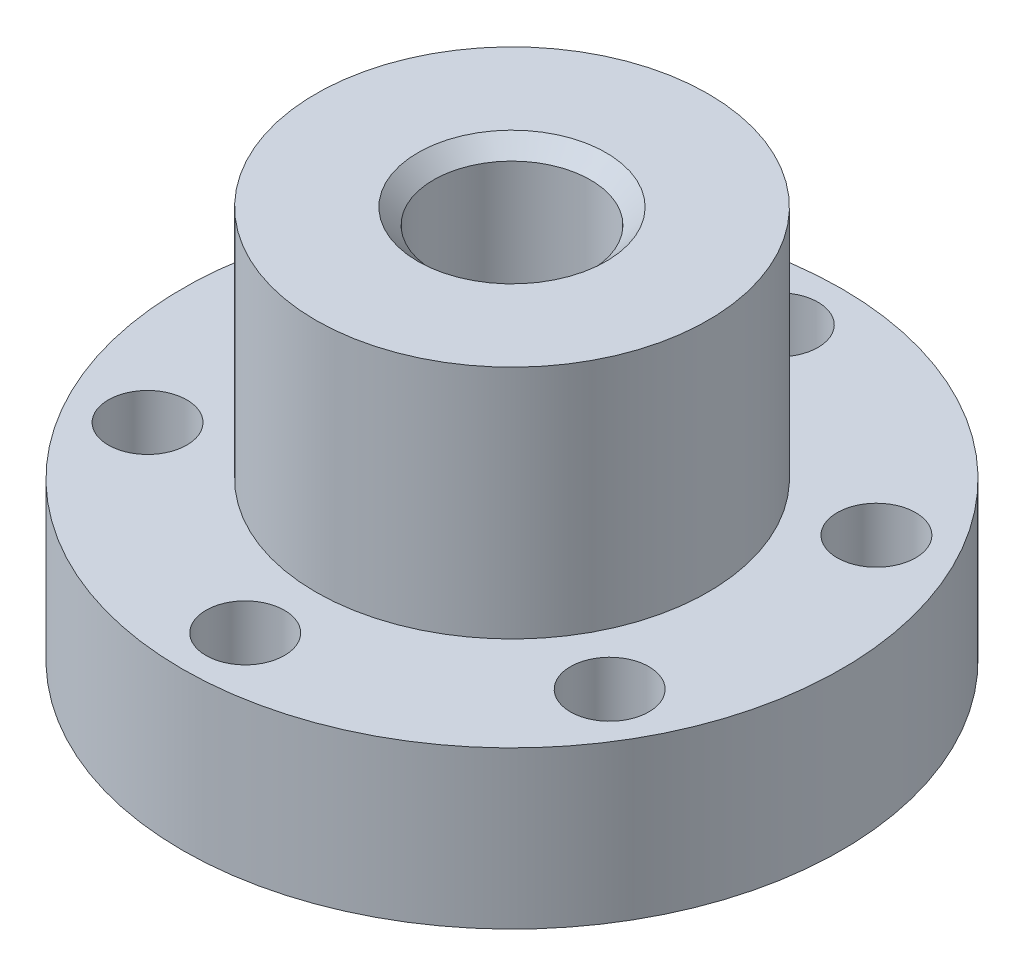
ISO-10303-21;
HEADER;
FILE_DESCRIPTION(('STEP AP214'),'2;1');
FILE_NAME('part.step','',(''),(''),'','','');
FILE_SCHEMA(('AUTOMOTIVE_DESIGN { 1 0 10303 214 1 1 1 1 }'));
ENDSEC;
DATA;
#1=APPLICATION_CONTEXT('core data for automotive mechanical design processes');
#2=APPLICATION_PROTOCOL_DEFINITION('international standard','automotive_design',2000,#1);
#3=PRODUCT_CONTEXT('',#1,'mechanical');
#4=PRODUCT('Part','Part','',(#3));
#5=PRODUCT_RELATED_PRODUCT_CATEGORY('part','',(#4));
#6=PRODUCT_DEFINITION_FORMATION('','',#4);
#7=PRODUCT_DEFINITION_CONTEXT('part definition',#1,'design');
#8=PRODUCT_DEFINITION('design','',#6,#7);
#9=PRODUCT_DEFINITION_SHAPE('','',#8);
#10=(LENGTH_UNIT() NAMED_UNIT(*) SI_UNIT(.MILLI.,.METRE.));
#11=(NAMED_UNIT(*) PLANE_ANGLE_UNIT() SI_UNIT($,.RADIAN.));
#12=(NAMED_UNIT(*) SI_UNIT($,.STERADIAN.) SOLID_ANGLE_UNIT());
#13=UNCERTAINTY_MEASURE_WITH_UNIT(LENGTH_MEASURE(1.E-05),#10,'distance_accuracy_value','');
#14=(GEOMETRIC_REPRESENTATION_CONTEXT(3) GLOBAL_UNCERTAINTY_ASSIGNED_CONTEXT((#13)) GLOBAL_UNIT_ASSIGNED_CONTEXT((#10,
#11,#12)) REPRESENTATION_CONTEXT('',''));
#15=CARTESIAN_POINT('',(0.,0.,0.));
#16=DIRECTION('',(0.,0.,1.));
#17=DIRECTION('',(1.,0.,0.));
#18=AXIS2_PLACEMENT_3D('',#15,#16,#17);
#19=CARTESIAN_POINT('',(0.,10.,0.));
#20=DIRECTION('',(0.,1.,0.));
#21=DIRECTION('',(0.,0.,1.));
#22=AXIS2_PLACEMENT_3D('',#19,#20,#21);
#23=PLANE('',#22);
#24=CARTESIAN_POINT('',(0.,10.,0.));
#25=DIRECTION('',(0.,1.,0.));
#26=DIRECTION('',(0.,0.,1.));
#27=AXIS2_PLACEMENT_3D('',#24,#25,#26);
#28=CIRCLE('',#27,12.5);
#29=CARTESIAN_POINT('',(0.,10.,12.5));
#30=VERTEX_POINT('',#29);
#31=EDGE_CURVE('E97',#30,#30,#28,.T.);
#32=ORIENTED_EDGE('',*,*,#31,.F.);
#33=EDGE_LOOP('',(#32));
#34=FACE_BOUND('',#33,.T.);
#35=CARTESIAN_POINT('',(-14.7224318643355,10.,8.50000000000001));
#36=DIRECTION('',(0.,1.,0.));
#37=DIRECTION('',(0.,0.,1.));
#38=AXIS2_PLACEMENT_3D('',#35,#36,#37);
#39=CIRCLE('',#38,2.5);
#40=CARTESIAN_POINT('',(-14.7224318643355,10.,11.));
#41=VERTEX_POINT('',#40);
#42=EDGE_CURVE('E82',#41,#41,#39,.T.);
#43=ORIENTED_EDGE('',*,*,#42,.F.);
#44=EDGE_LOOP('',(#43));
#45=FACE_BOUND('',#44,.T.);
#46=CARTESIAN_POINT('',(14.7224318643355,10.,8.5));
#47=DIRECTION('',(0.,1.,0.));
#48=DIRECTION('',(0.,0.,1.));
#49=AXIS2_PLACEMENT_3D('',#46,#47,#48);
#50=CIRCLE('',#49,2.5);
#51=CARTESIAN_POINT('',(14.7224318643355,10.,11.));
#52=VERTEX_POINT('',#51);
#53=EDGE_CURVE('E70',#52,#52,#50,.T.);
#54=ORIENTED_EDGE('',*,*,#53,.F.);
#55=EDGE_LOOP('',(#54));
#56=FACE_BOUND('',#55,.T.);
#57=CARTESIAN_POINT('',(0.,10.,-17.));
#58=DIRECTION('',(0.,1.,0.));
#59=DIRECTION('',(0.,0.,1.));
#60=AXIS2_PLACEMENT_3D('',#57,#58,#59);
#61=CIRCLE('',#60,2.5);
#62=CARTESIAN_POINT('',(0.,10.,-14.5));
#63=VERTEX_POINT('',#62);
#64=EDGE_CURVE('E58',#63,#63,#61,.T.);
#65=ORIENTED_EDGE('',*,*,#64,.F.);
#66=EDGE_LOOP('',(#65));
#67=FACE_BOUND('',#66,.T.);
#68=CARTESIAN_POINT('',(0.,10.,0.));
#69=DIRECTION('',(0.,1.,0.));
#70=DIRECTION('',(0.,0.,1.));
#71=AXIS2_PLACEMENT_3D('',#68,#69,#70);
#72=CIRCLE('',#71,21.);
#73=CARTESIAN_POINT('',(0.,10.,21.));
#74=VERTEX_POINT('',#73);
#75=EDGE_CURVE('E54',#74,#74,#72,.T.);
#76=ORIENTED_EDGE('',*,*,#75,.T.);
#77=EDGE_LOOP('',(#76));
#78=FACE_BOUND('',#77,.T.);
#79=CARTESIAN_POINT('',(14.7224318643355,10.,-8.5));
#80=DIRECTION('',(0.,1.,0.));
#81=DIRECTION('',(0.,0.,1.));
#82=AXIS2_PLACEMENT_3D('',#79,#80,#81);
#83=CIRCLE('',#82,2.5);
#84=CARTESIAN_POINT('',(14.7224318643355,10.,-6.));
#85=VERTEX_POINT('',#84);
#86=EDGE_CURVE('E64',#85,#85,#83,.T.);
#87=ORIENTED_EDGE('',*,*,#86,.F.);
#88=EDGE_LOOP('',(#87));
#89=FACE_BOUND('',#88,.T.);
#90=CARTESIAN_POINT('',(0.,10.,17.));
#91=DIRECTION('',(0.,1.,0.));
#92=DIRECTION('',(0.,0.,1.));
#93=AXIS2_PLACEMENT_3D('',#90,#91,#92);
#94=CIRCLE('',#93,2.5);
#95=CARTESIAN_POINT('',(0.,10.,19.5));
#96=VERTEX_POINT('',#95);
#97=EDGE_CURVE('E76',#96,#96,#94,.T.);
#98=ORIENTED_EDGE('',*,*,#97,.F.);
#99=EDGE_LOOP('',(#98));
#100=FACE_BOUND('',#99,.T.);
#101=CARTESIAN_POINT('',(-14.7224318643355,10.,-8.49999999999999));
#102=DIRECTION('',(0.,1.,0.));
#103=DIRECTION('',(0.,0.,1.));
#104=AXIS2_PLACEMENT_3D('',#101,#102,#103);
#105=CIRCLE('',#104,2.5);
#106=CARTESIAN_POINT('',(-14.7224318643355,10.,-5.99999999999999));
#107=VERTEX_POINT('',#106);
#108=EDGE_CURVE('E88',#107,#107,#105,.T.);
#109=ORIENTED_EDGE('',*,*,#108,.F.);
#110=EDGE_LOOP('',(#109));
#111=FACE_BOUND('',#110,.T.);
#112=ADVANCED_FACE('F33',(#34,#45,#56,#67,#78,#89,#100,#111),#23,.T.);
#113=CARTESIAN_POINT('',(0.,0.,0.));
#114=DIRECTION('',(0.,1.,0.));
#115=DIRECTION('',(0.,0.,1.));
#116=AXIS2_PLACEMENT_3D('',#113,#114,#115);
#117=PLANE('',#116);
#118=CARTESIAN_POINT('',(0.,0.,0.));
#119=DIRECTION('',(0.,1.,0.));
#120=DIRECTION('',(0.,0.,1.));
#121=AXIS2_PLACEMENT_3D('',#118,#119,#120);
#122=CIRCLE('',#121,6.);
#123=CARTESIAN_POINT('',(0.,0.,6.));
#124=VERTEX_POINT('',#123);
#125=EDGE_CURVE('E49',#124,#124,#122,.T.);
#126=ORIENTED_EDGE('',*,*,#125,.T.);
#127=EDGE_LOOP('',(#126));
#128=FACE_BOUND('',#127,.T.);
#129=CARTESIAN_POINT('',(0.,0.,0.));
#130=DIRECTION('',(0.,1.,0.));
#131=DIRECTION('',(0.,0.,1.));
#132=AXIS2_PLACEMENT_3D('',#129,#130,#131);
#133=CIRCLE('',#132,21.);
#134=CARTESIAN_POINT('',(0.,0.,21.));
#135=VERTEX_POINT('',#134);
#136=EDGE_CURVE('E55',#135,#135,#133,.T.);
#137=ORIENTED_EDGE('',*,*,#136,.F.);
#138=EDGE_LOOP('',(#137));
#139=FACE_BOUND('',#138,.T.);
#140=CARTESIAN_POINT('',(0.,0.,-17.));
#141=DIRECTION('',(0.,1.,0.));
#142=DIRECTION('',(0.,0.,1.));
#143=AXIS2_PLACEMENT_3D('',#140,#141,#142);
#144=CIRCLE('',#143,2.5);
#145=CARTESIAN_POINT('',(0.,0.,-14.5));
#146=VERTEX_POINT('',#145);
#147=EDGE_CURVE('E61',#146,#146,#144,.T.);
#148=ORIENTED_EDGE('',*,*,#147,.T.);
#149=EDGE_LOOP('',(#148));
#150=FACE_BOUND('',#149,.T.);
#151=CARTESIAN_POINT('',(14.7224318643355,0.,-8.5));
#152=DIRECTION('',(0.,1.,0.));
#153=DIRECTION('',(0.,0.,1.));
#154=AXIS2_PLACEMENT_3D('',#151,#152,#153);
#155=CIRCLE('',#154,2.5);
#156=CARTESIAN_POINT('',(14.7224318643355,0.,-6.));
#157=VERTEX_POINT('',#156);
#158=EDGE_CURVE('E67',#157,#157,#155,.T.);
#159=ORIENTED_EDGE('',*,*,#158,.T.);
#160=EDGE_LOOP('',(#159));
#161=FACE_BOUND('',#160,.T.);
#162=CARTESIAN_POINT('',(14.7224318643355,0.,8.5));
#163=DIRECTION('',(0.,1.,0.));
#164=DIRECTION('',(0.,0.,1.));
#165=AXIS2_PLACEMENT_3D('',#162,#163,#164);
#166=CIRCLE('',#165,2.5);
#167=CARTESIAN_POINT('',(14.7224318643355,0.,11.));
#168=VERTEX_POINT('',#167);
#169=EDGE_CURVE('E73',#168,#168,#166,.T.);
#170=ORIENTED_EDGE('',*,*,#169,.T.);
#171=EDGE_LOOP('',(#170));
#172=FACE_BOUND('',#171,.T.);
#173=CARTESIAN_POINT('',(0.,0.,17.));
#174=DIRECTION('',(0.,1.,0.));
#175=DIRECTION('',(0.,0.,1.));
#176=AXIS2_PLACEMENT_3D('',#173,#174,#175);
#177=CIRCLE('',#176,2.5);
#178=CARTESIAN_POINT('',(0.,0.,19.5));
#179=VERTEX_POINT('',#178);
#180=EDGE_CURVE('E79',#179,#179,#177,.T.);
#181=ORIENTED_EDGE('',*,*,#180,.T.);
#182=EDGE_LOOP('',(#181));
#183=FACE_BOUND('',#182,.T.);
#184=CARTESIAN_POINT('',(-14.7224318643355,0.,8.50000000000001));
#185=DIRECTION('',(0.,1.,0.));
#186=DIRECTION('',(0.,0.,1.));
#187=AXIS2_PLACEMENT_3D('',#184,#185,#186);
#188=CIRCLE('',#187,2.5);
#189=CARTESIAN_POINT('',(-14.7224318643355,0.,11.));
#190=VERTEX_POINT('',#189);
#191=EDGE_CURVE('E85',#190,#190,#188,.T.);
#192=ORIENTED_EDGE('',*,*,#191,.T.);
#193=EDGE_LOOP('',(#192));
#194=FACE_BOUND('',#193,.T.);
#195=CARTESIAN_POINT('',(-14.7224318643355,0.,-8.49999999999999));
#196=DIRECTION('',(0.,1.,0.));
#197=DIRECTION('',(0.,0.,1.));
#198=AXIS2_PLACEMENT_3D('',#195,#196,#197);
#199=CIRCLE('',#198,2.5);
#200=CARTESIAN_POINT('',(-14.7224318643355,0.,-5.99999999999999));
#201=VERTEX_POINT('',#200);
#202=EDGE_CURVE('E91',#201,#201,#199,.T.);
#203=ORIENTED_EDGE('',*,*,#202,.T.);
#204=EDGE_LOOP('',(#203));
#205=FACE_BOUND('',#204,.T.);
#206=ADVANCED_FACE('F114',(#128,#139,#150,#161,#172,#183,#194,#205),#117,.F.);
#207=CARTESIAN_POINT('',(0.,10.,0.));
#208=DIRECTION('',(0.,-1.,0.));
#209=DIRECTION('',(0.,0.,-1.));
#210=AXIS2_PLACEMENT_3D('',#207,#208,#209);
#211=CYLINDRICAL_SURFACE('',#210,21.);
#212=ORIENTED_EDGE('',*,*,#75,.F.);
#213=EDGE_LOOP('',(#212));
#214=FACE_BOUND('',#213,.T.);
#215=ORIENTED_EDGE('',*,*,#136,.T.);
#216=EDGE_LOOP('',(#215));
#217=FACE_BOUND('',#216,.T.);
#218=ADVANCED_FACE('F137',(#214,#217),#211,.T.);
#219=CARTESIAN_POINT('',(0.,10.,-17.));
#220=DIRECTION('',(0.,-1.,0.));
#221=DIRECTION('',(0.,0.,-1.));
#222=AXIS2_PLACEMENT_3D('',#219,#220,#221);
#223=CYLINDRICAL_SURFACE('',#222,2.5);
#224=ORIENTED_EDGE('',*,*,#64,.T.);
#225=EDGE_LOOP('',(#224));
#226=FACE_BOUND('',#225,.T.);
#227=ORIENTED_EDGE('',*,*,#147,.F.);
#228=EDGE_LOOP('',(#227));
#229=FACE_BOUND('',#228,.T.);
#230=ADVANCED_FACE('F143',(#226,#229),#223,.F.);
#231=CARTESIAN_POINT('',(14.7224318643355,10.,-8.5));
#232=DIRECTION('',(0.,-1.,0.));
#233=DIRECTION('',(0.,0.,-1.));
#234=AXIS2_PLACEMENT_3D('',#231,#232,#233);
#235=CYLINDRICAL_SURFACE('',#234,2.5);
#236=ORIENTED_EDGE('',*,*,#86,.T.);
#237=EDGE_LOOP('',(#236));
#238=FACE_BOUND('',#237,.T.);
#239=ORIENTED_EDGE('',*,*,#158,.F.);
#240=EDGE_LOOP('',(#239));
#241=FACE_BOUND('',#240,.T.);
#242=ADVANCED_FACE('F179',(#238,#241),#235,.F.);
#243=CARTESIAN_POINT('',(14.7224318643355,10.,8.5));
#244=DIRECTION('',(0.,-1.,0.));
#245=DIRECTION('',(0.,0.,-1.));
#246=AXIS2_PLACEMENT_3D('',#243,#244,#245);
#247=CYLINDRICAL_SURFACE('',#246,2.5);
#248=ORIENTED_EDGE('',*,*,#53,.T.);
#249=EDGE_LOOP('',(#248));
#250=FACE_BOUND('',#249,.T.);
#251=ORIENTED_EDGE('',*,*,#169,.F.);
#252=EDGE_LOOP('',(#251));
#253=FACE_BOUND('',#252,.T.);
#254=ADVANCED_FACE('F175',(#250,#253),#247,.F.);
#255=CARTESIAN_POINT('',(0.,10.,17.));
#256=DIRECTION('',(0.,-1.,0.));
#257=DIRECTION('',(0.,0.,-1.));
#258=AXIS2_PLACEMENT_3D('',#255,#256,#257);
#259=CYLINDRICAL_SURFACE('',#258,2.5);
#260=ORIENTED_EDGE('',*,*,#97,.T.);
#261=EDGE_LOOP('',(#260));
#262=FACE_BOUND('',#261,.T.);
#263=ORIENTED_EDGE('',*,*,#180,.F.);
#264=EDGE_LOOP('',(#263));
#265=FACE_BOUND('',#264,.T.);
#266=ADVANCED_FACE('F171',(#262,#265),#259,.F.);
#267=CARTESIAN_POINT('',(-14.7224318643355,10.,8.50000000000001));
#268=DIRECTION('',(0.,-1.,0.));
#269=DIRECTION('',(0.,0.,-1.));
#270=AXIS2_PLACEMENT_3D('',#267,#268,#269);
#271=CYLINDRICAL_SURFACE('',#270,2.5);
#272=ORIENTED_EDGE('',*,*,#42,.T.);
#273=EDGE_LOOP('',(#272));
#274=FACE_BOUND('',#273,.T.);
#275=ORIENTED_EDGE('',*,*,#191,.F.);
#276=EDGE_LOOP('',(#275));
#277=FACE_BOUND('',#276,.T.);
#278=ADVANCED_FACE('F132',(#274,#277),#271,.F.);
#279=CARTESIAN_POINT('',(-14.7224318643355,10.,-8.49999999999999));
#280=DIRECTION('',(0.,-1.,0.));
#281=DIRECTION('',(0.,0.,-1.));
#282=AXIS2_PLACEMENT_3D('',#279,#280,#281);
#283=CYLINDRICAL_SURFACE('',#282,2.5);
#284=ORIENTED_EDGE('',*,*,#108,.T.);
#285=EDGE_LOOP('',(#284));
#286=FACE_BOUND('',#285,.T.);
#287=ORIENTED_EDGE('',*,*,#202,.F.);
#288=EDGE_LOOP('',(#287));
#289=FACE_BOUND('',#288,.T.);
#290=ADVANCED_FACE('F108',(#286,#289),#283,.F.);
#291=CARTESIAN_POINT('',(0.,25.,0.));
#292=DIRECTION('',(0.,-1.,0.));
#293=DIRECTION('',(0.,0.,-1.));
#294=AXIS2_PLACEMENT_3D('',#291,#292,#293);
#295=CYLINDRICAL_SURFACE('',#294,12.5);
#296=CARTESIAN_POINT('',(0.,25.,0.));
#297=DIRECTION('',(0.,1.,0.));
#298=DIRECTION('',(0.,0.,1.));
#299=AXIS2_PLACEMENT_3D('',#296,#297,#298);
#300=CIRCLE('',#299,12.5);
#301=CARTESIAN_POINT('',(0.,25.,12.5));
#302=VERTEX_POINT('',#301);
#303=EDGE_CURVE('E94',#302,#302,#300,.T.);
#304=ORIENTED_EDGE('',*,*,#303,.F.);
#305=EDGE_LOOP('',(#304));
#306=FACE_BOUND('',#305,.T.);
#307=ORIENTED_EDGE('',*,*,#31,.T.);
#308=EDGE_LOOP('',(#307));
#309=FACE_BOUND('',#308,.T.);
#310=ADVANCED_FACE('F105',(#306,#309),#295,.T.);
#311=CARTESIAN_POINT('',(0.,25.,0.));
#312=DIRECTION('',(0.,1.,0.));
#313=DIRECTION('',(0.,0.,1.));
#314=AXIS2_PLACEMENT_3D('',#311,#312,#313);
#315=PLANE('',#314);
#316=CARTESIAN_POINT('',(0.,25.,0.));
#317=DIRECTION('',(0.,1.,0.));
#318=DIRECTION('',(0.,0.,1.));
#319=AXIS2_PLACEMENT_3D('',#316,#317,#318);
#320=CIRCLE('',#319,6.00000000000001);
#321=CARTESIAN_POINT('',(0.,25.,6.00000000000001));
#322=VERTEX_POINT('',#321);
#323=EDGE_CURVE('E10',#322,#322,#320,.F.);
#324=ORIENTED_EDGE('',*,*,#323,.T.);
#325=EDGE_LOOP('',(#324));
#326=FACE_BOUND('',#325,.T.);
#327=ORIENTED_EDGE('',*,*,#303,.T.);
#328=EDGE_LOOP('',(#327));
#329=FACE_BOUND('',#328,.T.);
#330=ADVANCED_FACE('F103',(#326,#329),#315,.T.);
#331=CARTESIAN_POINT('',(0.,0.,0.));
#332=DIRECTION('',(0.,1.,0.));
#333=DIRECTION('',(0.,0.,1.));
#334=AXIS2_PLACEMENT_3D('',#331,#332,#333);
#335=CYLINDRICAL_SURFACE('',#334,5.);
#336=CARTESIAN_POINT('',(0.,1.,0.));
#337=DIRECTION('',(0.,1.,0.));
#338=DIRECTION('',(0.,0.,1.));
#339=AXIS2_PLACEMENT_3D('',#336,#337,#338);
#340=CIRCLE('',#339,5.);
#341=CARTESIAN_POINT('',(0.,1.,5.));
#342=VERTEX_POINT('',#341);
#343=EDGE_CURVE('E41',#342,#342,#340,.F.);
#344=ORIENTED_EDGE('',*,*,#343,.T.);
#345=EDGE_LOOP('',(#344));
#346=FACE_BOUND('',#345,.T.);
#347=CARTESIAN_POINT('',(0.,24.,0.));
#348=DIRECTION('',(0.,1.,0.));
#349=DIRECTION('',(0.,0.,1.));
#350=AXIS2_PLACEMENT_3D('',#347,#348,#349);
#351=CIRCLE('',#350,5.);
#352=CARTESIAN_POINT('',(0.,24.,5.));
#353=VERTEX_POINT('',#352);
#354=EDGE_CURVE('E45',#353,#353,#351,.T.);
#355=ORIENTED_EDGE('',*,*,#354,.T.);
#356=EDGE_LOOP('',(#355));
#357=FACE_BOUND('',#356,.T.);
#358=ADVANCED_FACE('F153',(#346,#357),#335,.F.);
#359=CARTESIAN_POINT('',(0.,0.,0.));
#360=DIRECTION('',(0.,-1.,0.));
#361=DIRECTION('',(0.,0.,-1.));
#362=AXIS2_PLACEMENT_3D('',#359,#360,#361);
#363=CONICAL_SURFACE('',#362,6.,0.785398163397447);
#364=ORIENTED_EDGE('',*,*,#343,.F.);
#365=EDGE_LOOP('',(#364));
#366=FACE_BOUND('',#365,.T.);
#367=ORIENTED_EDGE('',*,*,#125,.F.);
#368=EDGE_LOOP('',(#367));
#369=FACE_BOUND('',#368,.T.);
#370=ADVANCED_FACE('F149',(#366,#369),#363,.F.);
#371=CARTESIAN_POINT('',(0.,24.,0.));
#372=DIRECTION('',(0.,1.,0.));
#373=DIRECTION('',(0.,0.,1.));
#374=AXIS2_PLACEMENT_3D('',#371,#372,#373);
#375=CONICAL_SURFACE('',#374,5.,0.785398163397454);
#376=ORIENTED_EDGE('',*,*,#323,.F.);
#377=EDGE_LOOP('',(#376));
#378=FACE_BOUND('',#377,.T.);
#379=ORIENTED_EDGE('',*,*,#354,.F.);
#380=EDGE_LOOP('',(#379));
#381=FACE_BOUND('',#380,.T.);
#382=ADVANCED_FACE('F36',(#378,#381),#375,.F.);
#383=CLOSED_SHELL('',(#112,#206,#218,#230,#242,#254,#266,#278,#290,#310,#330,#358,#370,#382));
#384=MANIFOLD_SOLID_BREP('B2',#383);
#385=ADVANCED_BREP_SHAPE_REPRESENTATION('',(#18,#384),#14);
#386=SHAPE_DEFINITION_REPRESENTATION(#9,#385);
ENDSEC;
END-ISO-10303-21;
